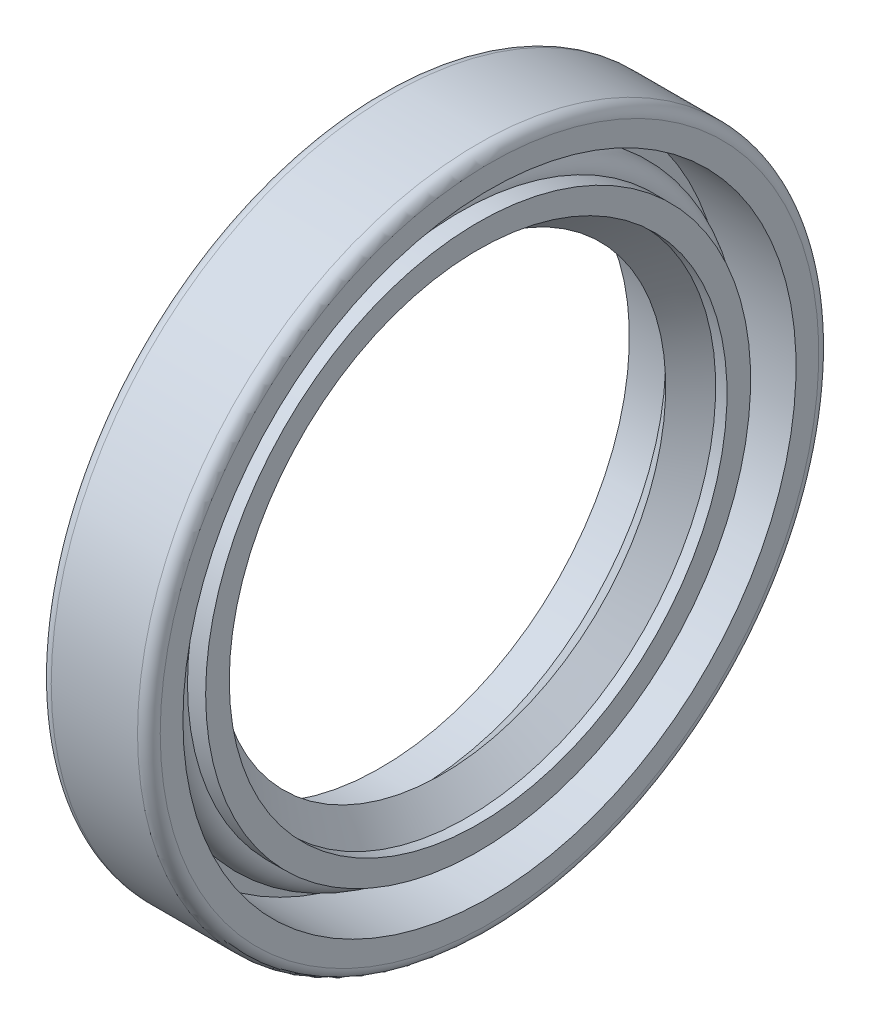
ISO-10303-21;
HEADER;
FILE_DESCRIPTION(('STEP AP214'),'2;1');
FILE_NAME('part.step','',(''),(''),'','','');
FILE_SCHEMA(('AUTOMOTIVE_DESIGN { 1 0 10303 214 1 1 1 1 }'));
ENDSEC;
DATA;
#1=APPLICATION_CONTEXT('core data for automotive mechanical design processes');
#2=APPLICATION_PROTOCOL_DEFINITION('international standard','automotive_design',2000,#1);
#3=PRODUCT_CONTEXT('',#1,'mechanical');
#4=PRODUCT('Part','Part','',(#3));
#5=PRODUCT_RELATED_PRODUCT_CATEGORY('part','',(#4));
#6=PRODUCT_DEFINITION_FORMATION('','',#4);
#7=PRODUCT_DEFINITION_CONTEXT('part definition',#1,'design');
#8=PRODUCT_DEFINITION('design','',#6,#7);
#9=PRODUCT_DEFINITION_SHAPE('','',#8);
#10=(LENGTH_UNIT() NAMED_UNIT(*) SI_UNIT(.MILLI.,.METRE.));
#11=(NAMED_UNIT(*) PLANE_ANGLE_UNIT() SI_UNIT($,.RADIAN.));
#12=(NAMED_UNIT(*) SI_UNIT($,.STERADIAN.) SOLID_ANGLE_UNIT());
#13=UNCERTAINTY_MEASURE_WITH_UNIT(LENGTH_MEASURE(1.E-05),#10,'distance_accuracy_value','');
#14=(GEOMETRIC_REPRESENTATION_CONTEXT(3) GLOBAL_UNCERTAINTY_ASSIGNED_CONTEXT((#13)) GLOBAL_UNIT_ASSIGNED_CONTEXT((#10,
#11,#12)) REPRESENTATION_CONTEXT('',''));
#15=CARTESIAN_POINT('',(0.,0.,0.));
#16=DIRECTION('',(0.,0.,1.));
#17=DIRECTION('',(1.,0.,0.));
#18=AXIS2_PLACEMENT_3D('',#15,#16,#17);
#19=CARTESIAN_POINT('',(-23.4257382163501,10.984602660263,0.));
#20=DIRECTION('',(1.,0.,0.));
#21=DIRECTION('',(0.,0.,-1.));
#22=AXIS2_PLACEMENT_3D('',#19,#20,#21);
#23=PLANE('',#22);
#24=CARTESIAN_POINT('',(-23.4257382163501,-8.06539733973698,0.));
#25=DIRECTION('',(1.,0.,0.));
#26=DIRECTION('',(0.,0.,-1.));
#27=AXIS2_PLACEMENT_3D('',#24,#25,#26);
#28=CIRCLE('',#27,18.415);
#29=CARTESIAN_POINT('',(-23.4257382163501,-8.06539733973698,-18.415));
#30=VERTEX_POINT('',#29);
#31=EDGE_CURVE('E10',#30,#30,#28,.F.);
#32=ORIENTED_EDGE('',*,*,#31,.T.);
#33=EDGE_LOOP('',(#32));
#34=FACE_BOUND('',#33,.T.);
#35=CARTESIAN_POINT('',(-23.4257382163501,-8.06539733973698,0.));
#36=DIRECTION('',(-1.,0.,0.));
#37=DIRECTION('',(0.,0.,1.));
#38=AXIS2_PLACEMENT_3D('',#35,#36,#37);
#39=CIRCLE('',#38,13.9192);
#40=CARTESIAN_POINT('',(-23.4257382163501,-8.06539733973698,13.9192));
#41=VERTEX_POINT('',#40);
#42=EDGE_CURVE('E83',#41,#41,#39,.T.);
#43=ORIENTED_EDGE('',*,*,#42,.F.);
#44=EDGE_LOOP('',(#43));
#45=FACE_BOUND('',#44,.T.);
#46=ADVANCED_FACE('F33',(#34,#45),#23,.F.);
#47=CARTESIAN_POINT('',(-23.4257382163501,-8.06539733973698,0.));
#48=DIRECTION('',(-1.,0.,0.));
#49=DIRECTION('',(0.,0.,1.));
#50=AXIS2_PLACEMENT_3D('',#47,#48,#49);
#51=CYLINDRICAL_SURFACE('',#50,19.05);
#52=CARTESIAN_POINT('',(-17.9647382163501,-8.06539733973698,0.));
#53=DIRECTION('',(-1.,0.,0.));
#54=DIRECTION('',(0.,0.,1.));
#55=AXIS2_PLACEMENT_3D('',#52,#53,#54);
#56=CIRCLE('',#55,19.05);
#57=CARTESIAN_POINT('',(-17.9647382163501,-8.06539733973698,19.05));
#58=VERTEX_POINT('',#57);
#59=EDGE_CURVE('E44',#58,#58,#56,.T.);
#60=ORIENTED_EDGE('',*,*,#59,.T.);
#61=EDGE_LOOP('',(#60));
#62=FACE_BOUND('',#61,.T.);
#63=CARTESIAN_POINT('',(-22.7907382163501,-8.06539733973698,0.));
#64=DIRECTION('',(1.,0.,0.));
#65=DIRECTION('',(0.,0.,-1.));
#66=AXIS2_PLACEMENT_3D('',#63,#64,#65);
#67=CIRCLE('',#66,19.05);
#68=CARTESIAN_POINT('',(-22.7907382163501,-8.06539733973698,-19.05));
#69=VERTEX_POINT('',#68);
#70=EDGE_CURVE('E48',#69,#69,#67,.T.);
#71=ORIENTED_EDGE('',*,*,#70,.T.);
#72=EDGE_LOOP('',(#71));
#73=FACE_BOUND('',#72,.T.);
#74=ADVANCED_FACE('F90',(#62,#73),#51,.T.);
#75=CARTESIAN_POINT('',(-17.3297382163501,10.984602660263,0.));
#76=DIRECTION('',(-1.,0.,0.));
#77=DIRECTION('',(0.,0.,1.));
#78=AXIS2_PLACEMENT_3D('',#75,#76,#77);
#79=PLANE('',#78);
#80=CARTESIAN_POINT('',(-17.3297382163501,-8.06539733973698,0.));
#81=DIRECTION('',(-1.,0.,0.));
#82=DIRECTION('',(0.,0.,1.));
#83=AXIS2_PLACEMENT_3D('',#80,#81,#82);
#84=CIRCLE('',#83,18.415);
#85=CARTESIAN_POINT('',(-17.3297382163501,-8.06539733973698,18.415));
#86=VERTEX_POINT('',#85);
#87=EDGE_CURVE('E40',#86,#86,#84,.F.);
#88=ORIENTED_EDGE('',*,*,#87,.T.);
#89=EDGE_LOOP('',(#88));
#90=FACE_BOUND('',#89,.T.);
#91=CARTESIAN_POINT('',(-17.3297382163501,-8.06539733973698,0.));
#92=DIRECTION('',(-1.,0.,0.));
#93=DIRECTION('',(0.,0.,1.));
#94=AXIS2_PLACEMENT_3D('',#91,#92,#93);
#95=CIRCLE('',#94,17.145);
#96=CARTESIAN_POINT('',(-17.3297382163501,-8.06539733973698,17.145));
#97=VERTEX_POINT('',#96);
#98=EDGE_CURVE('E53',#97,#97,#95,.T.);
#99=ORIENTED_EDGE('',*,*,#98,.T.);
#100=EDGE_LOOP('',(#99));
#101=FACE_BOUND('',#100,.T.);
#102=ADVANCED_FACE('F95',(#90,#101),#79,.F.);
#103=CARTESIAN_POINT('',(-23.4257382163501,-8.06539733973698,0.));
#104=DIRECTION('',(-1.,0.,0.));
#105=DIRECTION('',(0.,0.,1.));
#106=AXIS2_PLACEMENT_3D('',#103,#104,#105);
#107=CYLINDRICAL_SURFACE('',#106,17.145);
#108=ORIENTED_EDGE('',*,*,#98,.F.);
#109=EDGE_LOOP('',(#108));
#110=FACE_BOUND('',#109,.T.);
#111=CARTESIAN_POINT('',(-21.3937382163501,-8.06539733973698,0.));
#112=DIRECTION('',(-1.,0.,0.));
#113=DIRECTION('',(0.,0.,1.));
#114=AXIS2_PLACEMENT_3D('',#111,#112,#113);
#115=CIRCLE('',#114,17.145);
#116=CARTESIAN_POINT('',(-21.3937382163501,-8.06539733973698,17.145));
#117=VERTEX_POINT('',#116);
#118=EDGE_CURVE('E56',#117,#117,#115,.T.);
#119=ORIENTED_EDGE('',*,*,#118,.T.);
#120=EDGE_LOOP('',(#119));
#121=FACE_BOUND('',#120,.T.);
#122=ADVANCED_FACE('F149',(#110,#121),#107,.F.);
#123=CARTESIAN_POINT('',(-21.3937382163501,7.17460266026302,0.));
#124=DIRECTION('',(-1.,0.,0.));
#125=DIRECTION('',(0.,0.,1.));
#126=AXIS2_PLACEMENT_3D('',#123,#124,#125);
#127=PLANE('',#126);
#128=ORIENTED_EDGE('',*,*,#118,.F.);
#129=EDGE_LOOP('',(#128));
#130=FACE_BOUND('',#129,.T.);
#131=CARTESIAN_POINT('',(-21.3937382163501,-8.06539733973698,0.));
#132=DIRECTION('',(-1.,0.,0.));
#133=DIRECTION('',(0.,0.,1.));
#134=AXIS2_PLACEMENT_3D('',#131,#132,#133);
#135=CIRCLE('',#134,15.24);
#136=CARTESIAN_POINT('',(-21.3937382163501,-8.06539733973698,15.24));
#137=VERTEX_POINT('',#136);
#138=EDGE_CURVE('E59',#137,#137,#135,.T.);
#139=ORIENTED_EDGE('',*,*,#138,.T.);
#140=EDGE_LOOP('',(#139));
#141=FACE_BOUND('',#140,.T.);
#142=ADVANCED_FACE('F145',(#130,#141),#127,.F.);
#143=CARTESIAN_POINT('',(-23.4257382163501,-8.06539733973698,0.));
#144=DIRECTION('',(-1.,0.,0.));
#145=DIRECTION('',(0.,0.,1.));
#146=AXIS2_PLACEMENT_3D('',#143,#144,#145);
#147=CYLINDRICAL_SURFACE('',#146,15.24);
#148=ORIENTED_EDGE('',*,*,#138,.F.);
#149=EDGE_LOOP('',(#148));
#150=FACE_BOUND('',#149,.T.);
#151=CARTESIAN_POINT('',(-21.0127382163501,-8.06539733973698,0.));
#152=DIRECTION('',(-1.,0.,0.));
#153=DIRECTION('',(0.,0.,1.));
#154=AXIS2_PLACEMENT_3D('',#151,#152,#153);
#155=CIRCLE('',#154,15.24);
#156=CARTESIAN_POINT('',(-21.0127382163501,-8.06539733973698,15.24));
#157=VERTEX_POINT('',#156);
#158=EDGE_CURVE('E62',#157,#157,#155,.T.);
#159=ORIENTED_EDGE('',*,*,#158,.T.);
#160=EDGE_LOOP('',(#159));
#161=FACE_BOUND('',#160,.T.);
#162=ADVANCED_FACE('F141',(#150,#161),#147,.T.);
#163=CARTESIAN_POINT('',(-19.9967382163501,-8.06539733973698,0.));
#164=DIRECTION('',(-1.,0.,0.));
#165=DIRECTION('',(0.,0.,1.));
#166=AXIS2_PLACEMENT_3D('',#163,#164,#165);
#167=TOROIDAL_SURFACE('',#166,15.24,1.016);
#168=ORIENTED_EDGE('',*,*,#158,.F.);
#169=EDGE_LOOP('',(#168));
#170=FACE_BOUND('',#169,.T.);
#171=CARTESIAN_POINT('',(-18.9807382163501,-8.06539733973698,0.));
#172=DIRECTION('',(-1.,0.,0.));
#173=DIRECTION('',(0.,0.,1.));
#174=AXIS2_PLACEMENT_3D('',#171,#172,#173);
#175=CIRCLE('',#174,15.24);
#176=CARTESIAN_POINT('',(-18.9807382163501,-8.06539733973698,15.24));
#177=VERTEX_POINT('',#176);
#178=EDGE_CURVE('E65',#177,#177,#175,.T.);
#179=ORIENTED_EDGE('',*,*,#178,.T.);
#180=EDGE_LOOP('',(#179));
#181=FACE_BOUND('',#180,.T.);
#182=ADVANCED_FACE('F137',(#170,#181),#167,.T.);
#183=CARTESIAN_POINT('',(-23.4257382163501,-8.06539733973698,0.));
#184=DIRECTION('',(-1.,0.,0.));
#185=DIRECTION('',(0.,0.,1.));
#186=AXIS2_PLACEMENT_3D('',#183,#184,#185);
#187=CYLINDRICAL_SURFACE('',#186,15.24);
#188=ORIENTED_EDGE('',*,*,#178,.F.);
#189=EDGE_LOOP('',(#188));
#190=FACE_BOUND('',#189,.T.);
#191=CARTESIAN_POINT('',(-17.9647382163501,-8.06539733973698,0.));
#192=DIRECTION('',(-1.,0.,0.));
#193=DIRECTION('',(0.,0.,1.));
#194=AXIS2_PLACEMENT_3D('',#191,#192,#193);
#195=CIRCLE('',#194,15.24);
#196=CARTESIAN_POINT('',(-17.9647382163501,-8.06539733973698,15.24));
#197=VERTEX_POINT('',#196);
#198=EDGE_CURVE('E68',#197,#197,#195,.T.);
#199=ORIENTED_EDGE('',*,*,#198,.T.);
#200=EDGE_LOOP('',(#199));
#201=FACE_BOUND('',#200,.T.);
#202=ADVANCED_FACE('F133',(#190,#201),#187,.T.);
#203=CARTESIAN_POINT('',(-17.9647382163501,5.85380266026302,0.));
#204=DIRECTION('',(-1.,0.,0.));
#205=DIRECTION('',(0.,0.,1.));
#206=AXIS2_PLACEMENT_3D('',#203,#204,#205);
#207=PLANE('',#206);
#208=ORIENTED_EDGE('',*,*,#198,.F.);
#209=EDGE_LOOP('',(#208));
#210=FACE_BOUND('',#209,.T.);
#211=CARTESIAN_POINT('',(-17.9647382163501,-8.06539733973698,0.));
#212=DIRECTION('',(-1.,0.,0.));
#213=DIRECTION('',(0.,0.,1.));
#214=AXIS2_PLACEMENT_3D('',#211,#212,#213);
#215=CIRCLE('',#214,13.9192);
#216=CARTESIAN_POINT('',(-17.9647382163501,-8.06539733973698,13.9192));
#217=VERTEX_POINT('',#216);
#218=EDGE_CURVE('E71',#217,#217,#215,.T.);
#219=ORIENTED_EDGE('',*,*,#218,.T.);
#220=EDGE_LOOP('',(#219));
#221=FACE_BOUND('',#220,.T.);
#222=ADVANCED_FACE('F129',(#210,#221),#207,.F.);
#223=CARTESIAN_POINT('',(-23.4257382163501,-8.06539733973698,0.));
#224=DIRECTION('',(-1.,0.,0.));
#225=DIRECTION('',(0.,0.,1.));
#226=AXIS2_PLACEMENT_3D('',#223,#224,#225);
#227=CYLINDRICAL_SURFACE('',#226,13.9192);
#228=ORIENTED_EDGE('',*,*,#218,.F.);
#229=EDGE_LOOP('',(#228));
#230=FACE_BOUND('',#229,.T.);
#231=CARTESIAN_POINT('',(-18.5997382163501,-8.06539733973698,0.));
#232=DIRECTION('',(-1.,0.,0.));
#233=DIRECTION('',(0.,0.,1.));
#234=AXIS2_PLACEMENT_3D('',#231,#232,#233);
#235=CIRCLE('',#234,13.9192);
#236=CARTESIAN_POINT('',(-18.5997382163501,-8.06539733973698,13.9192));
#237=VERTEX_POINT('',#236);
#238=EDGE_CURVE('E74',#237,#237,#235,.T.);
#239=ORIENTED_EDGE('',*,*,#238,.T.);
#240=EDGE_LOOP('',(#239));
#241=FACE_BOUND('',#240,.T.);
#242=ADVANCED_FACE('F125',(#230,#241),#227,.F.);
#243=CARTESIAN_POINT('',(-19.9967382163501,-8.06539733973698,0.));
#244=DIRECTION('',(1.,0.,0.));
#245=DIRECTION('',(0.,0.,-1.));
#246=AXIS2_PLACEMENT_3D('',#243,#244,#245);
#247=CONICAL_SURFACE('',#246,12.5222,0.785398163397451);
#248=ORIENTED_EDGE('',*,*,#238,.F.);
#249=EDGE_LOOP('',(#248));
#250=FACE_BOUND('',#249,.T.);
#251=CARTESIAN_POINT('',(-19.9967382163501,-8.06539733973698,0.));
#252=DIRECTION('',(-1.,0.,0.));
#253=DIRECTION('',(0.,0.,1.));
#254=AXIS2_PLACEMENT_3D('',#251,#252,#253);
#255=CIRCLE('',#254,12.5222);
#256=CARTESIAN_POINT('',(-19.9967382163501,-8.06539733973698,12.5222));
#257=VERTEX_POINT('',#256);
#258=EDGE_CURVE('E77',#257,#257,#255,.T.);
#259=ORIENTED_EDGE('',*,*,#258,.T.);
#260=EDGE_LOOP('',(#259));
#261=FACE_BOUND('',#260,.T.);
#262=ADVANCED_FACE('F118',(#250,#261),#247,.F.);
#263=CARTESIAN_POINT('',(-21.3937382163501,-8.06539733973698,0.));
#264=DIRECTION('',(-1.,0.,0.));
#265=DIRECTION('',(0.,0.,1.));
#266=AXIS2_PLACEMENT_3D('',#263,#264,#265);
#267=CONICAL_SURFACE('',#266,13.9192,0.785398163397449);
#268=ORIENTED_EDGE('',*,*,#258,.F.);
#269=EDGE_LOOP('',(#268));
#270=FACE_BOUND('',#269,.T.);
#271=CARTESIAN_POINT('',(-21.3937382163501,-8.06539733973698,0.));
#272=DIRECTION('',(-1.,0.,0.));
#273=DIRECTION('',(0.,0.,1.));
#274=AXIS2_PLACEMENT_3D('',#271,#272,#273);
#275=CIRCLE('',#274,13.9192);
#276=CARTESIAN_POINT('',(-21.3937382163501,-8.06539733973698,13.9192));
#277=VERTEX_POINT('',#276);
#278=EDGE_CURVE('E80',#277,#277,#275,.T.);
#279=ORIENTED_EDGE('',*,*,#278,.T.);
#280=EDGE_LOOP('',(#279));
#281=FACE_BOUND('',#280,.T.);
#282=ADVANCED_FACE('F107',(#270,#281),#267,.F.);
#283=CARTESIAN_POINT('',(-23.4257382163501,-8.06539733973698,0.));
#284=DIRECTION('',(-1.,0.,0.));
#285=DIRECTION('',(0.,0.,1.));
#286=AXIS2_PLACEMENT_3D('',#283,#284,#285);
#287=CYLINDRICAL_SURFACE('',#286,13.9192);
#288=ORIENTED_EDGE('',*,*,#278,.F.);
#289=EDGE_LOOP('',(#288));
#290=FACE_BOUND('',#289,.T.);
#291=ORIENTED_EDGE('',*,*,#42,.T.);
#292=EDGE_LOOP('',(#291));
#293=FACE_BOUND('',#292,.T.);
#294=ADVANCED_FACE('F87',(#290,#293),#287,.F.);
#295=CARTESIAN_POINT('',(-17.9647382163501,-8.06539733973698,0.));
#296=DIRECTION('',(-1.,0.,0.));
#297=DIRECTION('',(0.,0.,1.));
#298=AXIS2_PLACEMENT_3D('',#295,#296,#297);
#299=TOROIDAL_SURFACE('',#298,18.415,0.635);
#300=ORIENTED_EDGE('',*,*,#87,.F.);
#301=EDGE_LOOP('',(#300));
#302=FACE_BOUND('',#301,.T.);
#303=ORIENTED_EDGE('',*,*,#59,.F.);
#304=EDGE_LOOP('',(#303));
#305=FACE_BOUND('',#304,.T.);
#306=ADVANCED_FACE('F99',(#302,#305),#299,.T.);
#307=CARTESIAN_POINT('',(-22.7907382163501,-8.06539733973698,0.));
#308=DIRECTION('',(1.,0.,0.));
#309=DIRECTION('',(0.,0.,-1.));
#310=AXIS2_PLACEMENT_3D('',#307,#308,#309);
#311=TOROIDAL_SURFACE('',#310,18.415,0.635);
#312=ORIENTED_EDGE('',*,*,#70,.F.);
#313=EDGE_LOOP('',(#312));
#314=FACE_BOUND('',#313,.T.);
#315=ORIENTED_EDGE('',*,*,#31,.F.);
#316=EDGE_LOOP('',(#315));
#317=FACE_BOUND('',#316,.T.);
#318=ADVANCED_FACE('F35',(#314,#317),#311,.T.);
#319=CLOSED_SHELL('',(#46,#74,#102,#122,#142,#162,#182,#202,#222,#242,#262,#282,#294,#306,#318));
#320=MANIFOLD_SOLID_BREP('B2',#319);
#321=ADVANCED_BREP_SHAPE_REPRESENTATION('',(#18,#320),#14);
#322=SHAPE_DEFINITION_REPRESENTATION(#9,#321);
ENDSEC;
END-ISO-10303-21;
